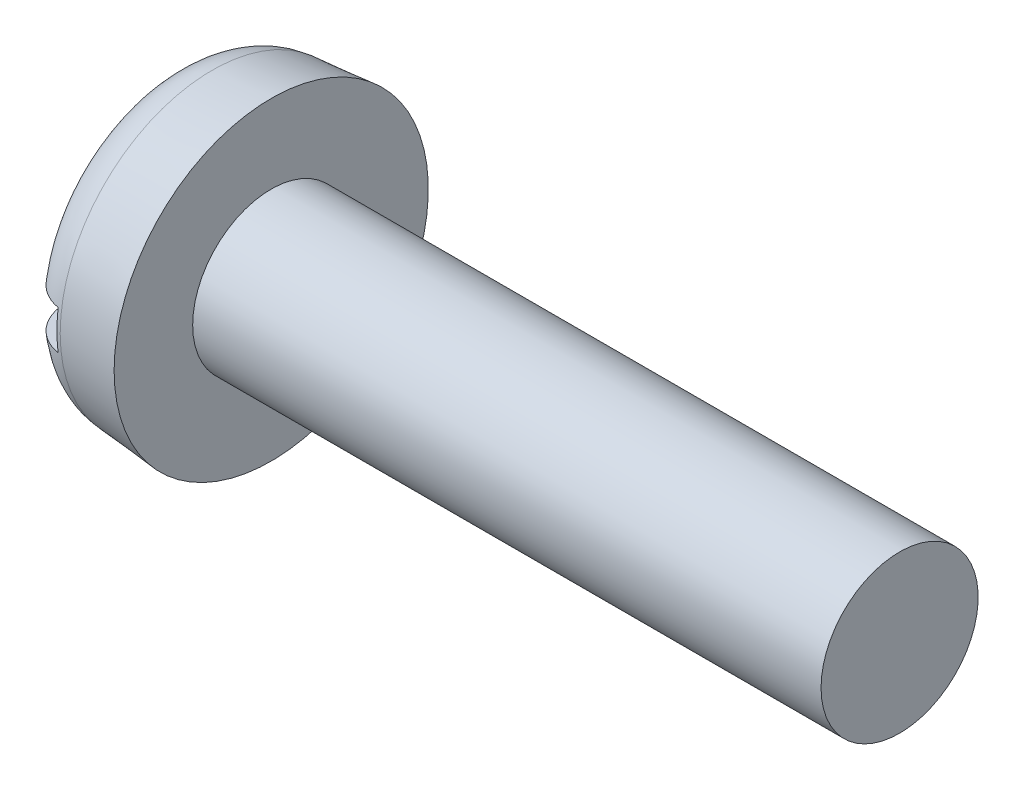
ISO-10303-21;
HEADER;
FILE_DESCRIPTION(('STEP AP214'),'2;1');
FILE_NAME('part.step','',(''),(''),'','','');
FILE_SCHEMA(('AUTOMOTIVE_DESIGN { 1 0 10303 214 1 1 1 1 }'));
ENDSEC;
DATA;
#1=APPLICATION_CONTEXT('core data for automotive mechanical design processes');
#2=APPLICATION_PROTOCOL_DEFINITION('international standard','automotive_design',2000,#1);
#3=PRODUCT_CONTEXT('',#1,'mechanical');
#4=PRODUCT('Part','Part','',(#3));
#5=PRODUCT_RELATED_PRODUCT_CATEGORY('part','',(#4));
#6=PRODUCT_DEFINITION_FORMATION('','',#4);
#7=PRODUCT_DEFINITION_CONTEXT('part definition',#1,'design');
#8=PRODUCT_DEFINITION('design','',#6,#7);
#9=PRODUCT_DEFINITION_SHAPE('','',#8);
#10=(LENGTH_UNIT() NAMED_UNIT(*) SI_UNIT(.MILLI.,.METRE.));
#11=(NAMED_UNIT(*) PLANE_ANGLE_UNIT() SI_UNIT($,.RADIAN.));
#12=(NAMED_UNIT(*) SI_UNIT($,.STERADIAN.) SOLID_ANGLE_UNIT());
#13=UNCERTAINTY_MEASURE_WITH_UNIT(LENGTH_MEASURE(1.E-05),#10,'distance_accuracy_value','');
#14=(GEOMETRIC_REPRESENTATION_CONTEXT(3) GLOBAL_UNCERTAINTY_ASSIGNED_CONTEXT((#13)) GLOBAL_UNIT_ASSIGNED_CONTEXT((#10,
#11,#12)) REPRESENTATION_CONTEXT('',''));
#15=CARTESIAN_POINT('',(0.,0.,0.));
#16=DIRECTION('',(0.,0.,1.));
#17=DIRECTION('',(1.,0.,0.));
#18=AXIS2_PLACEMENT_3D('',#15,#16,#17);
#19=CARTESIAN_POINT('',(0.,0.,0.));
#20=DIRECTION('',(-1.,0.,0.));
#21=DIRECTION('',(0.,0.,1.));
#22=AXIS2_PLACEMENT_3D('',#19,#20,#21);
#23=PLANE('',#22);
#24=DIRECTION('',(0.,0.,-1.));
#25=VECTOR('',#24,1.);
#26=CARTESIAN_POINT('',(0.,0.25,2.));
#27=LINE('',#26,#25);
#28=CARTESIAN_POINT('',(0.,0.25,1.3128752634498));
#29=VERTEX_POINT('',#28);
#30=CARTESIAN_POINT('',(0.,0.25,-1.3128752634498));
#31=VERTEX_POINT('',#30);
#32=EDGE_CURVE('E89',#29,#31,#27,.T.);
#33=ORIENTED_EDGE('',*,*,#32,.F.);
#34=CARTESIAN_POINT('',(0.,0.,0.));
#35=DIRECTION('',(-1.,0.,0.));
#36=DIRECTION('',(0.,0.,1.));
#37=AXIS2_PLACEMENT_3D('',#34,#35,#36);
#38=CIRCLE('',#37,1.33646603300584);
#39=EDGE_CURVE('E95',#29,#31,#38,.T.);
#40=ORIENTED_EDGE('',*,*,#39,.T.);
#41=EDGE_LOOP('',(#33,#40));
#42=FACE_BOUND('',#41,.T.);
#43=ADVANCED_FACE('F35',(#42),#23,.T.);
#44=CARTESIAN_POINT('',(-25.4,0.,0.));
#45=DIRECTION('',(-1.,0.,0.));
#46=DIRECTION('',(0.,0.,1.));
#47=AXIS2_PLACEMENT_3D('',#44,#45,#46);
#48=CYLINDRICAL_SURFACE('',#47,1.);
#49=CARTESIAN_POINT('',(9.3,0.,0.));
#50=DIRECTION('',(-1.,0.,0.));
#51=DIRECTION('',(0.,0.,1.));
#52=AXIS2_PLACEMENT_3D('',#49,#50,#51);
#53=CIRCLE('',#52,1.);
#54=CARTESIAN_POINT('',(9.3,0.,1.));
#55=VERTEX_POINT('',#54);
#56=EDGE_CURVE('E96',#55,#55,#53,.T.);
#57=ORIENTED_EDGE('',*,*,#56,.T.);
#58=EDGE_LOOP('',(#57));
#59=FACE_BOUND('',#58,.T.);
#60=CARTESIAN_POINT('',(1.3,0.,0.));
#61=DIRECTION('',(-1.,0.,0.));
#62=DIRECTION('',(0.,0.,1.));
#63=AXIS2_PLACEMENT_3D('',#60,#61,#62);
#64=CIRCLE('',#63,1.);
#65=CARTESIAN_POINT('',(1.3,0.,1.));
#66=VERTEX_POINT('',#65);
#67=EDGE_CURVE('E156',#66,#66,#64,.T.);
#68=ORIENTED_EDGE('',*,*,#67,.F.);
#69=EDGE_LOOP('',(#68));
#70=FACE_BOUND('',#69,.T.);
#71=ADVANCED_FACE('F144',(#59,#70),#48,.T.);
#72=CARTESIAN_POINT('',(9.3,1.,0.));
#73=DIRECTION('',(1.,0.,0.));
#74=DIRECTION('',(0.,0.,-1.));
#75=AXIS2_PLACEMENT_3D('',#72,#73,#74);
#76=PLANE('',#75);
#77=ORIENTED_EDGE('',*,*,#56,.F.);
#78=EDGE_LOOP('',(#77));
#79=FACE_BOUND('',#78,.T.);
#80=ADVANCED_FACE('F142',(#79),#76,.T.);
#81=DIRECTION('',(0.,0.,1.));
#82=VECTOR('',#81,1.);
#83=CARTESIAN_POINT('',(0.,-0.25,-2.));
#84=LINE('',#83,#82);
#85=CARTESIAN_POINT('',(0.,-0.25,-1.3128752634498));
#86=VERTEX_POINT('',#85);
#87=CARTESIAN_POINT('',(0.,-0.25,1.3128752634498));
#88=VERTEX_POINT('',#87);
#89=EDGE_CURVE('E80',#86,#88,#84,.T.);
#90=ORIENTED_EDGE('',*,*,#89,.F.);
#91=EDGE_CURVE('E87',#86,#88,#38,.T.);
#92=ORIENTED_EDGE('',*,*,#91,.T.);
#93=EDGE_LOOP('',(#90,#92));
#94=FACE_BOUND('',#93,.T.);
#95=ADVANCED_FACE('F86',(#94),#23,.T.);
#96=CARTESIAN_POINT('',(0.,0.,0.));
#97=DIRECTION('',(1.,0.,0.));
#98=DIRECTION('',(0.,0.,-1.));
#99=AXIS2_PLACEMENT_3D('',#96,#97,#98);
#100=CONICAL_SURFACE('',#99,1.8862647374163,0.0872664625997166);
#101=CARTESIAN_POINT('',(0.547706554351404,0.,0.));
#102=DIRECTION('',(-1.,0.,0.));
#103=DIRECTION('',(0.,0.,1.));
#104=AXIS2_PLACEMENT_3D('',#101,#102,#103);
#105=CIRCLE('',#104,1.93418285186089);
#106=CARTESIAN_POINT('',(0.547706554351404,0.,1.93418285186089));
#107=VERTEX_POINT('',#106);
#108=EDGE_CURVE('E99',#107,#107,#105,.F.);
#109=ORIENTED_EDGE('',*,*,#108,.T.);
#110=EDGE_LOOP('',(#109));
#111=FACE_BOUND('',#110,.T.);
#112=CARTESIAN_POINT('',(1.3,0.,0.));
#113=DIRECTION('',(-1.,0.,0.));
#114=DIRECTION('',(0.,0.,1.));
#115=AXIS2_PLACEMENT_3D('',#112,#113,#114);
#116=CIRCLE('',#115,2.);
#117=CARTESIAN_POINT('',(1.3,0.,2.));
#118=VERTEX_POINT('',#117);
#119=EDGE_CURVE('E101',#118,#118,#116,.T.);
#120=ORIENTED_EDGE('',*,*,#119,.T.);
#121=EDGE_LOOP('',(#120));
#122=FACE_BOUND('',#121,.T.);
#123=ADVANCED_FACE('F135',(#111,#122),#100,.T.);
#124=CARTESIAN_POINT('',(1.3,1.,0.));
#125=DIRECTION('',(-1.,0.,0.));
#126=DIRECTION('',(0.,0.,1.));
#127=AXIS2_PLACEMENT_3D('',#124,#125,#126);
#128=PLANE('',#127);
#129=ORIENTED_EDGE('',*,*,#119,.F.);
#130=EDGE_LOOP('',(#129));
#131=FACE_BOUND('',#130,.T.);
#132=ORIENTED_EDGE('',*,*,#67,.T.);
#133=EDGE_LOOP('',(#132));
#134=FACE_BOUND('',#133,.T.);
#135=ADVANCED_FACE('F131',(#131,#134),#128,.F.);
#136=CARTESIAN_POINT('',(0.6,0.,0.));
#137=DIRECTION('',(-1.,0.,0.));
#138=DIRECTION('',(0.,0.,1.));
#139=AXIS2_PLACEMENT_3D('',#136,#137,#138);
#140=TOROIDAL_SURFACE('',#139,1.33646603300584,0.6);
#141=CARTESIAN_POINT('',(0.274780655200361,0.25,-1.82362420667529));
#142=CARTESIAN_POINT('',(0.302850124065662,0.25,-1.84189666141675));
#143=CARTESIAN_POINT('',(0.332476912836235,0.25,-1.85782010480749));
#144=CARTESIAN_POINT('',(0.394006386294874,0.25,-1.8844828387307));
#145=CARTESIAN_POINT('',(0.425911622330593,0.25,-1.89521620967586));
#146=CARTESIAN_POINT('',(0.49106542171139,0.25,-1.91116335358415));
#147=CARTESIAN_POINT('',(0.524313546486278,0.25,-1.91637891370101));
#148=CARTESIAN_POINT('',(0.591204792683811,0.25,-1.92113959303415));
#149=CARTESIAN_POINT('',(0.624847818162146,0.25,-1.92068606223462));
#150=CARTESIAN_POINT('',(0.691513871966761,0.25,-1.91413229696864));
#151=CARTESIAN_POINT('',(0.724537965843794,0.25,-1.90804289638476));
#152=CARTESIAN_POINT('',(0.789097481854443,0.25,-1.89041111372299));
#153=CARTESIAN_POINT('',(0.820632856008674,0.25,-1.87886855602915));
#154=CARTESIAN_POINT('',(0.881355504744871,0.25,-1.85065407323916));
#155=CARTESIAN_POINT('',(0.910540461536868,0.25,-1.8339771613426));
#156=CARTESIAN_POINT('',(0.965713973197687,0.25,-1.7959832160475));
#157=CARTESIAN_POINT('',(0.991702483157431,0.25,-1.77466611746743));
#158=CARTESIAN_POINT('',(1.03989067692429,0.25,-1.72788939986325));
#159=CARTESIAN_POINT('',(1.06207077173726,0.25,-1.70240960587084));
#160=CARTESIAN_POINT('',(1.10188385808005,0.25,-1.64811708765422));
#161=CARTESIAN_POINT('',(1.11951669564412,0.25,-1.61930425062421));
#162=CARTESIAN_POINT('',(1.14991644324992,0.25,-1.55888388907361));
#163=CARTESIAN_POINT('',(1.16263701266532,0.25,-1.52725305653232));
#164=CARTESIAN_POINT('',(1.18266472006596,0.25,-1.46232290586992));
#165=CARTESIAN_POINT('',(1.18997153304379,0.25,-1.42902348770568));
#166=CARTESIAN_POINT('',(1.1990757467124,0.25,-1.36122512528321));
#167=CARTESIAN_POINT('',(1.2007978533932,0.25,-1.3267160782536));
#168=CARTESIAN_POINT('',(1.19852158611446,0.25,-1.25788795964169));
#169=CARTESIAN_POINT('',(1.19452272743365,0.25,-1.22356890440419));
#170=CARTESIAN_POINT('',(1.18084584012593,0.25,-1.15550299104831));
#171=CARTESIAN_POINT('',(1.1710768980116,0.25,-1.12177439719896));
#172=CARTESIAN_POINT('',(1.14608963326822,0.25,-1.05639845281472));
#173=CARTESIAN_POINT('',(1.13087072283895,0.25,-1.02475132721021));
#174=CARTESIAN_POINT('',(1.09517672424942,0.25,-0.964015185217592));
#175=CARTESIAN_POINT('',(1.07463585116154,0.25,-0.934964791126672));
#176=CARTESIAN_POINT('',(1.0289468611237,0.25,-0.880736843040394));
#177=CARTESIAN_POINT('',(1.00379831827947,0.25,-0.855559647447028));
#178=CARTESIAN_POINT('',(0.949690395648163,0.25,-0.809995267822458));
#179=CARTESIAN_POINT('',(0.920750663668052,0.25,-0.789584802369704));
#180=CARTESIAN_POINT('',(0.859743350231913,0.25,-0.754142685467499));
#181=CARTESIAN_POINT('',(0.827676707896818,0.25,-0.739109425347756));
#182=CARTESIAN_POINT('',(0.762667368563303,0.25,-0.715550940340568));
#183=CARTESIAN_POINT('',(0.729809776019389,0.25,-0.706791374099582));
#184=CARTESIAN_POINT('',(0.663065073704784,0.25,-0.695254567880968));
#185=CARTESIAN_POINT('',(0.629178416423444,0.25,-0.69247473610395));
#186=CARTESIAN_POINT('',(0.563211392329522,0.25,-0.693020234763517));
#187=CARTESIAN_POINT('',(0.531128042957494,0.25,-0.696037951412193));
#188=CARTESIAN_POINT('',(0.467930020079841,0.25,-0.707432616918485));
#189=CARTESIAN_POINT('',(0.436815388934093,0.25,-0.715809799789359));
#190=CARTESIAN_POINT('',(0.376446381647119,0.25,-0.737546549416802));
#191=CARTESIAN_POINT('',(0.347188974627552,0.25,-0.750897740765059));
#192=CARTESIAN_POINT('',(0.29118144985243,0.25,-0.782096393740082));
#193=CARTESIAN_POINT('',(0.264431855473699,0.25,-0.799944791073732));
#194=CARTESIAN_POINT('',(0.21280112205241,0.25,-0.840563479123866));
#195=CARTESIAN_POINT('',(0.18807630516109,0.25,-0.863532471122662));
#196=CARTESIAN_POINT('',(0.142632089074548,0.25,-0.913140155498345));
#197=CARTESIAN_POINT('',(0.121913544381091,0.25,-0.939779628685344));
#198=CARTESIAN_POINT('',(0.0841798141603358,0.25,-0.997238681509955));
#199=CARTESIAN_POINT('',(0.0673637911083437,0.25,-1.02818930073671));
#200=CARTESIAN_POINT('',(0.0390991703503447,0.25,-1.09245311591645));
#201=CARTESIAN_POINT('',(0.0276510234354347,0.25,-1.12576651002353));
#202=CARTESIAN_POINT('',(0.0103722361801808,0.25,-1.19421384118873));
#203=CARTESIAN_POINT('',(0.0046047866229466,0.25,-1.2293637757047));
#204=CARTESIAN_POINT('',(-0.000878679151094724,0.25,-1.30013265464533));
#205=CARTESIAN_POINT('',(-0.000595165424060139,0.25,-1.33575156242399));
#206=CARTESIAN_POINT('',(0.00602927957051824,0.25,-1.40603493785938));
#207=CARTESIAN_POINT('',(0.0123048116822739,0.25,-1.44070555722832));
#208=CARTESIAN_POINT('',(0.0306887868415263,0.25,-1.50847558350848));
#209=CARTESIAN_POINT('',(0.0427982176917193,0.25,-1.54157472329189));
#210=CARTESIAN_POINT('',(0.0722935157774219,0.25,-1.60468559872415));
#211=CARTESIAN_POINT('',(0.0895922457386432,0.25,-1.63473812116026));
#212=CARTESIAN_POINT('',(0.129048154505429,0.25,-1.6914266708082));
#213=CARTESIAN_POINT('',(0.151198946684604,0.25,-1.71806711686356));
#214=CARTESIAN_POINT('',(0.190498702041562,0.25,-1.75782741941758));
#215=CARTESIAN_POINT('',(0.206359023192159,0.25,-1.77224346176931));
#216=CARTESIAN_POINT('',(0.23952762918078,0.25,-1.79930107726038));
#217=CARTESIAN_POINT('',(0.256835902453732,0.25,-1.81194266457048));
#218=CARTESIAN_POINT('',(0.274780655200361,0.25,-1.82362420667529));
#219=B_SPLINE_CURVE_WITH_KNOTS('',3,(#141,#142,#143,#144,#145,#146,#147,#148,#149,#150,#151,
#152,#153,#154,#155,#156,#157,#158,#159,#160,#161,#162,#163,#164,#165,#166,#167,#168,#169,#170,
#171,#172,#173,#174,#175,#176,#177,#178,#179,#180,#181,#182,#183,#184,#185,#186,#187,#188,#189,
#190,#191,#192,#193,#194,#195,#196,#197,#198,#199,#200,#201,#202,#203,#204,#205,#206,#207,#208,
#209,#210,#211,#212,#213,#214,#215,#216,#217,#218),.UNSPECIFIED.,.T.,.F.,(4,2,2,2,2,2,2,2,2,2,2,
2,2,2,2,2,2,2,2,2,2,2,2,2,2,2,2,2,2,2,2,2,2,2,2,2,2,2,4),(0.,0.100401062182579,
0.200916369230917,0.301399110583017,0.401857924372673,0.502124025494567,0.602393355851687,
0.702760382831541,0.803128819775641,0.903998978686787,1.00487255251616,1.10667574998262,
1.20848505856888,1.31166139334771,1.41484647048427,1.5197024094854,1.62456966101414,
1.73080076101002,1.83704168507411,1.94275232230141,2.04843130812937,2.14992147627128,
2.25136764660652,2.34757938832311,2.44379533127149,2.53984998938428,2.6359246495452,
2.73671855873459,2.83753394270023,2.9427139364961,3.04790276166498,3.1542488966228,
3.26058677033834,3.36577714242787,3.4709853317399,3.57451735589247,3.67791391414109,
3.74210061585798,3.8062868049523),.UNSPECIFIED.);
#220=CARTESIAN_POINT('',(0.5,0.25,-1.91179742470572));
#221=VERTEX_POINT('',#220);
#222=EDGE_CURVE('E11',#31,#221,#219,.T.);
#223=ORIENTED_EDGE('',*,*,#222,.F.);
#224=ORIENTED_EDGE('',*,*,#39,.F.);
#225=CARTESIAN_POINT('',(0.25647797126752,0.25,0.806687931408376));
#226=CARTESIAN_POINT('',(0.283073772587687,0.25,0.787245268924266));
#227=CARTESIAN_POINT('',(0.311256734673757,0.25,0.769944535846651));
#228=CARTESIAN_POINT('',(0.370114008258176,0.25,0.740229039319213));
#229=CARTESIAN_POINT('',(0.400789824440839,0.25,0.727817253657524));
#230=CARTESIAN_POINT('',(0.463871915221717,0.25,0.708374903085697));
#231=CARTESIAN_POINT('',(0.496281146765579,0.25,0.701353868838656));
#232=CARTESIAN_POINT('',(0.561820079529305,0.25,0.693064165401108));
#233=CARTESIAN_POINT('',(0.594949507008968,0.25,0.691793347727689));
#234=CARTESIAN_POINT('',(0.659868599580709,0.25,0.695008568960631));
#235=CARTESIAN_POINT('',(0.691667437306452,0.25,0.699313344775918));
#236=CARTESIAN_POINT('',(0.754098929301161,0.25,0.713169938820386));
#237=CARTESIAN_POINT('',(0.784731434429555,0.25,0.722722425688242));
#238=CARTESIAN_POINT('',(0.844220886452171,0.25,0.746760750983483));
#239=CARTESIAN_POINT('',(0.873064893626733,0.25,0.761278483323786));
#240=CARTESIAN_POINT('',(0.928072070248523,0.25,0.794719206207591));
#241=CARTESIAN_POINT('',(0.954234673131182,0.25,0.81364312499944));
#242=CARTESIAN_POINT('',(1.00455764012357,0.25,0.856403426025716));
#243=CARTESIAN_POINT('',(1.02854601727969,0.25,0.880442281861904));
#244=CARTESIAN_POINT('',(1.07233969055911,0.25,0.93206911063745));
#245=CARTESIAN_POINT('',(1.09214414470062,0.25,0.959657796158255));
#246=CARTESIAN_POINT('',(1.1277806057224,0.25,1.01880991735135));
#247=CARTESIAN_POINT('',(1.14342273788476,0.25,1.05048797462787));
#248=CARTESIAN_POINT('',(1.16921417457241,0.25,1.11600811372881));
#249=CARTESIAN_POINT('',(1.17936312023956,0.25,1.14985033677212));
#250=CARTESIAN_POINT('',(1.19390640883483,0.25,1.21901855241697));
#251=CARTESIAN_POINT('',(1.198256990977,0.25,1.25435377468586));
#252=CARTESIAN_POINT('',(1.20088701701162,0.25,1.32525082928571));
#253=CARTESIAN_POINT('',(1.19916675302153,0.25,1.36081265063096));
#254=CARTESIAN_POINT('',(1.18971168250471,0.25,1.43069187166979));
#255=CARTESIAN_POINT('',(1.18204966947663,0.25,1.46501910735442));
#256=CARTESIAN_POINT('',(1.16097413489613,0.25,1.53186104297244));
#257=CARTESIAN_POINT('',(1.14756110125118,0.25,1.5643758964011));
#258=CARTESIAN_POINT('',(1.11560510746244,0.25,1.62610187095566));
#259=CARTESIAN_POINT('',(1.097149951566,0.25,1.65535845455428));
#260=CARTESIAN_POINT('',(1.05552533497899,0.25,1.71030063892362));
#261=CARTESIAN_POINT('',(1.03235623843943,0.25,1.73598651527295));
#262=CARTESIAN_POINT('',(0.982310027591305,0.25,1.78268807238429));
#263=CARTESIAN_POINT('',(0.955488368089889,0.25,1.80376319341113));
#264=CARTESIAN_POINT('',(0.898659765129522,0.25,1.8410604546949));
#265=CARTESIAN_POINT('',(0.868652997996469,0.25,1.85728286340582));
#266=CARTESIAN_POINT('',(0.806611342278962,0.25,1.88426128245479));
#267=CARTESIAN_POINT('',(0.774598152543608,0.25,1.89506720989169));
#268=CARTESIAN_POINT('',(0.709207275735754,0.25,1.91112053581599));
#269=CARTESIAN_POINT('',(0.67582963400342,0.25,1.91636811884914));
#270=CARTESIAN_POINT('',(0.608837656027687,0.25,1.92113717337632));
#271=CARTESIAN_POINT('',(0.575225363311112,0.25,1.92068739829934));
#272=CARTESIAN_POINT('',(0.508554909070377,0.25,1.91414489858889));
#273=CARTESIAN_POINT('',(0.475496740593514,0.25,1.90805224481175));
#274=CARTESIAN_POINT('',(0.410905076842549,0.25,1.89041194259857));
#275=CARTESIAN_POINT('',(0.379370111612107,0.25,1.87886967409414));
#276=CARTESIAN_POINT('',(0.318677746934266,0.25,1.85066978427311));
#277=CARTESIAN_POINT('',(0.289520360090016,0.25,1.83401213584294));
#278=CARTESIAN_POINT('',(0.234312878154215,0.25,1.79600861494103));
#279=CARTESIAN_POINT('',(0.20827228119735,0.25,1.77464894819558));
#280=CARTESIAN_POINT('',(0.160116194508203,0.25,1.72788872147726));
#281=CARTESIAN_POINT('',(0.13800080840638,0.25,1.70248805485052));
#282=CARTESIAN_POINT('',(0.0981483460954305,0.25,1.64818018628309));
#283=CARTESIAN_POINT('',(0.0804433545930309,0.25,1.61924944626991));
#284=CARTESIAN_POINT('',(0.0500800334875073,0.25,1.55885213954979));
#285=CARTESIAN_POINT('',(0.0374219573508648,0.25,1.52738544557741));
#286=CARTESIAN_POINT('',(0.0173499908938403,0.25,1.46242951274809));
#287=CARTESIAN_POINT('',(0.00999744820991976,0.25,1.42892132543473));
#288=CARTESIAN_POINT('',(0.000932027792608532,0.25,1.36115298475673));
#289=CARTESIAN_POINT('',(-0.00078066275159485,0.25,1.32689280647116));
#290=CARTESIAN_POINT('',(0.00145026647964888,0.25,1.25804055944597));
#291=CARTESIAN_POINT('',(0.0054795473212617,0.25,1.22345127364072));
#292=CARTESIAN_POINT('',(0.0191955913899645,0.25,1.15540432623591));
#293=CARTESIAN_POINT('',(0.0288841889000252,0.25,1.12194703525683));
#294=CARTESIAN_POINT('',(0.0538243357846501,0.25,1.05655247440412));
#295=CARTESIAN_POINT('',(0.0691636585180377,0.25,1.02464870679869));
#296=CARTESIAN_POINT('',(0.104937128864068,0.25,0.963866007236643));
#297=CARTESIAN_POINT('',(0.125366421619971,0.25,0.934984229941663));
#298=CARTESIAN_POINT('',(0.164028944144066,0.25,0.889058344229295));
#299=CARTESIAN_POINT('',(0.181121312132095,0.25,0.87104130385289));
#300=CARTESIAN_POINT('',(0.217335307543651,0.25,0.837174222613301));
#301=CARTESIAN_POINT('',(0.236456923370607,0.25,0.821324169367588));
#302=CARTESIAN_POINT('',(0.25647797126752,0.25,0.806687931408376));
#303=B_SPLINE_CURVE_WITH_KNOTS('',3,(#225,#226,#227,#228,#229,#230,#231,#232,#233,#234,#235,
#236,#237,#238,#239,#240,#241,#242,#243,#244,#245,#246,#247,#248,#249,#250,#251,#252,#253,#254,
#255,#256,#257,#258,#259,#260,#261,#262,#263,#264,#265,#266,#267,#268,#269,#270,#271,#272,#273,
#274,#275,#276,#277,#278,#279,#280,#281,#282,#283,#284,#285,#286,#287,#288,#289,#290,#291,#292,
#293,#294,#295,#296,#297,#298,#299,#300,#301,#302),.UNSPECIFIED.,.T.,.F.,(4,2,2,2,2,2,2,2,2,2,2,
2,2,2,2,2,2,2,2,2,2,2,2,2,2,2,2,2,2,2,2,2,2,2,2,2,2,2,4),(0.,0.0987501477700194,
0.19756035018262,0.296544845923676,0.39549235452428,0.491302394396121,0.587124644765227,
0.68357433728144,0.780044367203688,0.881471955879884,0.9829199366625,1.08841286316154,
1.19391268045661,1.30020428911123,1.40649078328765,1.51149532344498,1.61649095694569,
1.71976342015201,1.82302790860739,1.92487039176505,2.02670723991341,2.12758748528433,
2.22846438116773,2.32883237519779,2.42919910894713,2.52946696584731,2.62973535421627,
2.73030191514127,2.83087113075401,2.93215189853696,3.03343775220811,3.13587677944123,
3.23831920663671,3.34230600671742,3.44632652944514,3.5520360732953,3.65764517390562,
3.73198370247418,3.80632180624214),.UNSPECIFIED.);
#304=CARTESIAN_POINT('',(0.5,0.25,1.91179742470572));
#305=VERTEX_POINT('',#304);
#306=EDGE_CURVE('E114',#305,#29,#303,.T.);
#307=ORIENTED_EDGE('',*,*,#306,.F.);
#308=CARTESIAN_POINT('',(0.5,0.,0.));
#309=DIRECTION('',(-1.,0.,0.));
#310=DIRECTION('',(0.,0.,1.));
#311=AXIS2_PLACEMENT_3D('',#308,#309,#310);
#312=CIRCLE('',#311,1.92807401131581);
#313=CARTESIAN_POINT('',(0.5,-0.25,1.91179742470572));
#314=VERTEX_POINT('',#313);
#315=EDGE_CURVE('E107',#305,#314,#312,.F.);
#316=ORIENTED_EDGE('',*,*,#315,.T.);
#317=CARTESIAN_POINT('',(0.25647797126752,-0.25,0.806687931408376));
#318=CARTESIAN_POINT('',(0.22811461508231,-0.25,0.827425620219486));
#319=CARTESIAN_POINT('',(0.201516055297732,-0.25,0.850630894293789));
#320=CARTESIAN_POINT('',(0.152571331977692,-0.25,0.901208782716564));
#321=CARTESIAN_POINT('',(0.130232677758372,-0.25,0.928588605834286));
#322=CARTESIAN_POINT('',(0.0904534192406149,-0.25,0.986651718459008));
#323=CARTESIAN_POINT('',(0.0730064503192135,-0.25,1.0173306428444));
#324=CARTESIAN_POINT('',(0.0434602329462481,-0.25,1.08114792064194));
#325=CARTESIAN_POINT('',(0.0313588569417125,-0.25,1.11428528944574));
#326=CARTESIAN_POINT('',(0.0127636490885256,-0.25,1.1824429151294));
#327=CARTESIAN_POINT('',(0.00632467814466832,-0.25,1.21747817526152));
#328=CARTESIAN_POINT('',(-0.000517283901222851,-0.25,1.28813764188796));
#329=CARTESIAN_POINT('',(-0.000920002337641604,-0.25,1.3237618749142));
#330=CARTESIAN_POINT('',(0.00434800778750704,-0.25,1.39420239184286));
#331=CARTESIAN_POINT('',(0.00995817056286311,-0.25,1.42902319077614));
#332=CARTESIAN_POINT('',(0.0270441493196886,-0.25,1.49719541380208));
#333=CARTESIAN_POINT('',(0.0385194335615698,-0.25,1.53054697080046));
#334=CARTESIAN_POINT('',(0.066805333326315,-0.25,1.59425150405687));
#335=CARTESIAN_POINT('',(0.083525525219693,-0.25,1.62464463268788));
#336=CARTESIAN_POINT('',(0.121902514595007,-0.25,1.6821361772215));
#337=CARTESIAN_POINT('',(0.143558907828022,-0.25,1.70923486264318));
#338=CARTESIAN_POINT('',(0.190851277951756,-0.25,1.75895715118281));
#339=CARTESIAN_POINT('',(0.216425242565036,-0.25,1.78163974924995));
#340=CARTESIAN_POINT('',(0.271051715066319,-0.25,1.82233619463279));
#341=CARTESIAN_POINT('',(0.30010402112743,-0.25,1.84035031264008));
#342=CARTESIAN_POINT('',(0.360541640657975,-0.25,1.87101228101318));
#343=CARTESIAN_POINT('',(0.39190020239549,-0.25,1.88371287767629));
#344=CARTESIAN_POINT('',(0.456312001468162,-0.25,1.90363448924139));
#345=CARTESIAN_POINT('',(0.489365175345781,-0.25,1.91085570916788));
#346=CARTESIAN_POINT('',(0.556022772858472,-0.25,1.91957878374415));
#347=CARTESIAN_POINT('',(0.589622905521806,-0.25,1.92111345806165));
#348=CARTESIAN_POINT('',(0.656602284044621,-0.25,1.91850953421242));
#349=CARTESIAN_POINT('',(0.689981533445374,-0.25,1.9143710272225));
#350=CARTESIAN_POINT('',(0.755513913993921,-0.25,1.9005544490505));
#351=CARTESIAN_POINT('',(0.787669009716197,-0.25,1.89088569056007));
#352=CARTESIAN_POINT('',(0.849904715559474,-0.25,1.86629884137169));
#353=CARTESIAN_POINT('',(0.879985320055665,-0.25,1.85138073644125));
#354=CARTESIAN_POINT('',(0.937296248504193,-0.25,1.8166898208882));
#355=CARTESIAN_POINT('',(0.964519921503605,-0.25,1.79690602558855));
#356=CARTESIAN_POINT('',(1.01528516641715,-0.25,1.75307523190286));
#357=CARTESIAN_POINT('',(1.03882665732028,-0.25,1.72902813974565));
#358=CARTESIAN_POINT('',(1.08172595916947,-0.25,1.6771960618535));
#359=CARTESIAN_POINT('',(1.10105627962252,-0.25,1.64938832937458));
#360=CARTESIAN_POINT('',(1.13482995867941,-0.25,1.59094992813551));
#361=CARTESIAN_POINT('',(1.1492731095708,-0.25,1.56031913946136));
#362=CARTESIAN_POINT('',(1.17303442993066,-0.25,1.49675978182125));
#363=CARTESIAN_POINT('',(1.18229654757927,-0.25,1.46381026645167));
#364=CARTESIAN_POINT('',(1.19524406921989,-0.25,1.39683436474365));
#365=CARTESIAN_POINT('',(1.19892909236176,-0.25,1.36280790502451));
#366=CARTESIAN_POINT('',(1.2006801090878,-0.25,1.29411335821481));
#367=CARTESIAN_POINT('',(1.19866316593094,-0.25,1.25944316342795));
#368=CARTESIAN_POINT('',(1.18893397437426,-0.25,1.19091174344461));
#369=CARTESIAN_POINT('',(1.18122120940792,-0.25,1.15705059190959));
#370=CARTESIAN_POINT('',(1.1601769908767,-0.25,1.09051812196973));
#371=CARTESIAN_POINT('',(1.14675676173025,-0.25,1.05787487044025));
#372=CARTESIAN_POINT('',(1.11467775754884,-0.25,0.995269036554545));
#373=CARTESIAN_POINT('',(1.09601835733878,-0.25,0.965306774676048));
#374=CARTESIAN_POINT('',(1.05376852779922,-0.25,0.90864809451225));
#375=CARTESIAN_POINT('',(1.03013402245569,-0.25,0.881984499365602));
#376=CARTESIAN_POINT('',(0.978662413228472,-0.25,0.833068820610379));
#377=CARTESIAN_POINT('',(0.950825230537789,-0.25,0.810816819744432));
#378=CARTESIAN_POINT('',(0.892141273449015,-0.25,0.771800498870371));
#379=CARTESIAN_POINT('',(0.861346635725294,-0.25,0.754957957909246));
#380=CARTESIAN_POINT('',(0.797264463313658,-0.25,0.726991035263803));
#381=CARTESIAN_POINT('',(0.7639781524147,-0.25,0.715863867305707));
#382=CARTESIAN_POINT('',(0.697614354203182,-0.25,0.700248790529691));
#383=CARTESIAN_POINT('',(0.664607567426841,-0.25,0.69546044216975));
#384=CARTESIAN_POINT('',(0.598260395579764,-0.25,0.691762050694227));
#385=CARTESIAN_POINT('',(0.56492001469045,-0.25,0.692851933990089));
#386=CARTESIAN_POINT('',(0.500305713906347,-0.25,0.700686922928174));
#387=CARTESIAN_POINT('',(0.469003002412091,-0.25,0.707199303446527));
#388=CARTESIAN_POINT('',(0.407926960128378,-0.25,0.725286338726901));
#389=CARTESIAN_POINT('',(0.378151979755175,-0.25,0.736855399235375));
#390=CARTESIAN_POINT('',(0.333202955789929,-0.25,0.75861828709463));
#391=CARTESIAN_POINT('',(0.317258156054092,-0.25,0.767262590798233));
#392=CARTESIAN_POINT('',(0.286211704034722,-0.25,0.785948392377951));
#393=CARTESIAN_POINT('',(0.271110004852099,-0.25,0.795989812428051));
#394=CARTESIAN_POINT('',(0.25647797126752,-0.25,0.806687931408376));
#395=B_SPLINE_CURVE_WITH_KNOTS('',3,(#317,#318,#319,#320,#321,#322,#323,#324,#325,#326,#327,
#328,#329,#330,#331,#332,#333,#334,#335,#336,#337,#338,#339,#340,#341,#342,#343,#344,#345,#346,
#347,#348,#349,#350,#351,#352,#353,#354,#355,#356,#357,#358,#359,#360,#361,#362,#363,#364,#365,
#366,#367,#368,#369,#370,#371,#372,#373,#374,#375,#376,#377,#378,#379,#380,#381,#382,#383,#384,
#385,#386,#387,#388,#389,#390,#391,#392,#393,#394),.UNSPECIFIED.,.T.,.F.,(4,2,2,2,2,2,2,2,2,2,2,
2,2,2,2,2,2,2,2,2,2,2,2,2,2,2,2,2,2,2,2,2,2,2,2,2,2,2,4),(0.,0.105339517541497,
0.210863043847173,0.316248628408819,0.421592231495568,0.527945567697215,0.634303708007108,
0.739600518645185,0.8448877846295,0.948451329469218,1.05200639604478,1.1540654205465,
1.25611852605422,1.35713304654448,1.45814378713888,1.55857063213837,1.65899586314173,
1.75925247843266,1.85950936555035,1.95999470219394,2.06048224928579,2.16160732902587,
2.2627367062024,2.36493999460764,2.46715026198412,2.57085482340577,2.67456879117567,
2.77995861689427,2.88536102382396,2.9917397945569,3.09812056031159,3.20288545926039,
3.30759923619073,3.40714743935949,3.50669439630456,3.60217675632204,3.69755374960456,
3.75189912320181,3.80624147071477),.UNSPECIFIED.);
#396=EDGE_CURVE('E94',#88,#314,#395,.T.);
#397=ORIENTED_EDGE('',*,*,#396,.F.);
#398=ORIENTED_EDGE('',*,*,#91,.F.);
#399=CARTESIAN_POINT('',(0.274780655200361,-0.25,-1.82362420667529));
#400=CARTESIAN_POINT('',(0.246412102452132,-0.25,-1.80515338183894));
#401=CARTESIAN_POINT('',(0.219592447243559,-0.25,-1.78425531890811));
#402=CARTESIAN_POINT('',(0.169833030497775,-0.25,-1.73822266295481));
#403=CARTESIAN_POINT('',(0.146898387228131,-0.25,-1.71308256697065));
#404=CARTESIAN_POINT('',(0.1055857901035,-0.25,-1.6593372656025));
#405=CARTESIAN_POINT('',(0.0872036369512321,-0.25,-1.6307352900536));
#406=CARTESIAN_POINT('',(0.0554631702647635,-0.25,-1.57088061633069));
#407=CARTESIAN_POINT('',(0.042103598378234,-0.25,-1.53962858450699));
#408=CARTESIAN_POINT('',(0.0206432771902913,-0.25,-1.47507749615836));
#409=CARTESIAN_POINT('',(0.0125876254984657,-0.25,-1.44176345508561));
#410=CARTESIAN_POINT('',(0.00209404371654314,-0.25,-1.37426177356359));
#411=CARTESIAN_POINT('',(-0.000343263952376132,-0.25,-1.34007403674719));
#412=CARTESIAN_POINT('',(0.000426825088754887,-0.25,-1.27125045227628));
#413=CARTESIAN_POINT('',(0.00371931456959648,-0.25,-1.23661556247096));
#414=CARTESIAN_POINT('',(0.0159771202394861,-0.25,-1.16836487965491));
#415=CARTESIAN_POINT('',(0.0249429593885406,-0.25,-1.1347491808909));
#416=CARTESIAN_POINT('',(0.0484576079098382,-0.25,-1.06892310437898));
#417=CARTESIAN_POINT('',(0.0630932921348853,-0.25,-1.03674374367566));
#418=CARTESIAN_POINT('',(0.0975178908169317,-0.25,-0.975266378936165));
#419=CARTESIAN_POINT('',(0.117307414846904,-0.25,-0.945968716299346));
#420=CARTESIAN_POINT('',(0.16167877507065,-0.25,-0.890885916345781));
#421=CARTESIAN_POINT('',(0.186295749588469,-0.25,-0.865129042953097));
#422=CARTESIAN_POINT('',(0.239578542918412,-0.25,-0.818201903765189));
#423=CARTESIAN_POINT('',(0.268244266621966,-0.25,-0.797031530258765));
#424=CARTESIAN_POINT('',(0.328272519519931,-0.25,-0.760396018098179));
#425=CARTESIAN_POINT('',(0.359573150112363,-0.25,-0.744829720355554));
#426=CARTESIAN_POINT('',(0.424438831887224,-0.25,-0.719501501346933));
#427=CARTESIAN_POINT('',(0.458002805134312,-0.25,-0.709736838442931));
#428=CARTESIAN_POINT('',(0.524586152437569,-0.25,-0.696826910772117));
#429=CARTESIAN_POINT('',(0.557544486769873,-0.25,-0.693366517126951));
#430=CARTESIAN_POINT('',(0.623554751672407,-0.25,-0.692262369608287));
#431=CARTESIAN_POINT('',(0.656606659486082,-0.25,-0.694617305616992));
#432=CARTESIAN_POINT('',(0.720611933799709,-0.25,-0.704833460708912));
#433=CARTESIAN_POINT('',(0.751597966403629,-0.25,-0.712492488093248));
#434=CARTESIAN_POINT('',(0.811898810445143,-0.25,-0.732772492269664));
#435=CARTESIAN_POINT('',(0.841213363360533,-0.25,-0.745394234257513));
#436=CARTESIAN_POINT('',(0.898189202124165,-0.25,-0.775523337991995));
#437=CARTESIAN_POINT('',(0.925787684286252,-0.25,-0.793149196355938));
#438=CARTESIAN_POINT('',(0.977832434568893,-0.25,-0.832561153237771));
#439=CARTESIAN_POINT('',(1.00227799166311,-0.25,-0.854348187417305));
#440=CARTESIAN_POINT('',(1.04866939922734,-0.25,-0.902723861616108));
#441=CARTESIAN_POINT('',(1.07041372154462,-0.25,-0.929505970910613));
#442=CARTESIAN_POINT('',(1.10925507245311,-0.25,-0.986252581526153));
#443=CARTESIAN_POINT('',(1.12635132905473,-0.25,-1.01621761034511));
#444=CARTESIAN_POINT('',(1.15587826370585,-0.25,-1.07945315539287));
#445=CARTESIAN_POINT('',(1.16815613299896,-0.25,-1.11279518659324));
#446=CARTESIAN_POINT('',(1.18693723838892,-0.25,-1.18106947273944));
#447=CARTESIAN_POINT('',(1.1934403543256,-0.25,-1.2160017607592));
#448=CARTESIAN_POINT('',(1.20044092616513,-0.25,-1.28644113223491));
#449=CARTESIAN_POINT('',(1.20094258611858,-0.25,-1.32194779587657));
#450=CARTESIAN_POINT('',(1.19588430233747,-0.25,-1.39252791212313));
#451=CARTESIAN_POINT('',(1.19032476970293,-0.25,-1.42760139394538));
#452=CARTESIAN_POINT('',(1.17338401955317,-0.25,-1.49576581682078));
#453=CARTESIAN_POINT('',(1.16208963405868,-0.25,-1.52887833044069));
#454=CARTESIAN_POINT('',(1.13401256129969,-0.25,-1.59268937671455));
#455=CARTESIAN_POINT('',(1.11723033304274,-0.25,-1.62338811099263));
#456=CARTESIAN_POINT('',(1.07894820628702,-0.25,-1.68097986318951));
#457=CARTESIAN_POINT('',(1.05752802949783,-0.25,-1.70792588292094));
#458=CARTESIAN_POINT('',(1.01041587459131,-0.25,-1.75778184073562));
#459=CARTESIAN_POINT('',(0.984724190633808,-0.25,-1.78069205652324));
#460=CARTESIAN_POINT('',(0.930145997257693,-0.25,-1.82153088343964));
#461=CARTESIAN_POINT('',(0.901303114330233,-0.25,-1.83951781323057));
#462=CARTESIAN_POINT('',(0.84098944475348,-0.25,-1.87034790500803));
#463=CARTESIAN_POINT('',(0.809518891529289,-0.25,-1.88319152330656));
#464=CARTESIAN_POINT('',(0.745117220679504,-0.25,-1.90327101630393));
#465=CARTESIAN_POINT('',(0.712199973113326,-0.25,-1.91055140172039));
#466=CARTESIAN_POINT('',(0.645600086806311,-0.25,-1.91946097417425));
#467=CARTESIAN_POINT('',(0.611917272957428,-0.25,-1.92108885495024));
#468=CARTESIAN_POINT('',(0.544871876047508,-0.25,-1.91864749728835));
#469=CARTESIAN_POINT('',(0.511508609397815,-0.25,-1.91459667979622));
#470=CARTESIAN_POINT('',(0.445965972419363,-0.25,-1.90095089068297));
#471=CARTESIAN_POINT('',(0.413785173235375,-0.25,-1.89136286121127));
#472=CARTESIAN_POINT('',(0.363791372711458,-0.25,-1.87176511786162));
#473=CARTESIAN_POINT('',(0.345312453158673,-0.25,-1.86340950174437));
#474=CARTESIAN_POINT('',(0.309297583953017,-0.25,-1.84486721881352));
#475=CARTESIAN_POINT('',(0.291761631921714,-0.25,-1.83468055661862));
#476=CARTESIAN_POINT('',(0.274780655200361,-0.25,-1.82362420667529));
#477=B_SPLINE_CURVE_WITH_KNOTS('',3,(#399,#400,#401,#402,#403,#404,#405,#406,#407,#408,#409,
#410,#411,#412,#413,#414,#415,#416,#417,#418,#419,#420,#421,#422,#423,#424,#425,#426,#427,#428,
#429,#430,#431,#432,#433,#434,#435,#436,#437,#438,#439,#440,#441,#442,#443,#444,#445,#446,#447,
#448,#449,#450,#451,#452,#453,#454,#455,#456,#457,#458,#459,#460,#461,#462,#463,#464,#465,#466,
#467,#468,#469,#470,#471,#472,#473,#474,#475,#476),.UNSPECIFIED.,.T.,.F.,(4,2,2,2,2,2,2,2,2,2,2,
2,2,2,2,2,2,2,2,2,2,2,2,2,2,2,2,2,2,2,2,2,2,2,2,2,2,2,4),(0.,0.101480580506103,
0.203093832917957,0.304613003415435,0.406106722427988,0.50845263418779,0.610809883665933,
0.714700232898651,0.818600159967563,0.924159397786762,1.02973112635202,1.13610190501634,
1.24247018535583,1.34680873724124,1.45109794328897,1.55001387342549,1.64890752112834,
1.74422508190664,1.83955734536687,1.93736831081816,2.0352012955127,2.13822665399301,
2.24126911334704,2.34735670277911,2.45344649961387,2.55946197564848,2.66547026163701,
2.76991930669343,2.87435961778195,2.97713002210324,3.07989335201045,3.18138079965786,
3.28285924139422,3.38351701076899,3.48419804002939,3.58455322803929,3.68478287038869,
3.74552772886801,3.80627243412447),.UNSPECIFIED.);
#478=CARTESIAN_POINT('',(0.5,-0.25,-1.91179742470572));
#479=VERTEX_POINT('',#478);
#480=EDGE_CURVE('E48',#479,#86,#477,.T.);
#481=ORIENTED_EDGE('',*,*,#480,.F.);
#482=EDGE_CURVE('E60',#479,#221,#312,.F.);
#483=ORIENTED_EDGE('',*,*,#482,.T.);
#484=EDGE_LOOP('',(#223,#224,#307,#316,#397,#398,#481,#483));
#485=FACE_BOUND('',#484,.T.);
#486=ORIENTED_EDGE('',*,*,#108,.F.);
#487=EDGE_LOOP('',(#486));
#488=FACE_BOUND('',#487,.T.);
#489=ADVANCED_FACE('F37',(#485,#488),#140,.T.);
#490=CARTESIAN_POINT('',(0.5,0.25,2.));
#491=DIRECTION('',(0.,1.,0.));
#492=DIRECTION('',(0.,0.,1.));
#493=AXIS2_PLACEMENT_3D('',#490,#491,#492);
#494=PLANE('',#493);
#495=ORIENTED_EDGE('',*,*,#222,.T.);
#496=DIRECTION('',(0.,0.,-1.));
#497=VECTOR('',#496,1.);
#498=CARTESIAN_POINT('',(0.5,0.25,2.));
#499=LINE('',#498,#497);
#500=EDGE_CURVE('E88',#305,#221,#499,.T.);
#501=ORIENTED_EDGE('',*,*,#500,.F.);
#502=ORIENTED_EDGE('',*,*,#306,.T.);
#503=ORIENTED_EDGE('',*,*,#32,.T.);
#504=EDGE_LOOP('',(#495,#501,#502,#503));
#505=FACE_BOUND('',#504,.T.);
#506=ADVANCED_FACE('F122',(#505),#494,.F.);
#507=CARTESIAN_POINT('',(0.5,-0.25,-2.));
#508=DIRECTION('',(0.,-1.,0.));
#509=DIRECTION('',(0.,0.,-1.));
#510=AXIS2_PLACEMENT_3D('',#507,#508,#509);
#511=PLANE('',#510);
#512=ORIENTED_EDGE('',*,*,#480,.T.);
#513=ORIENTED_EDGE('',*,*,#89,.T.);
#514=ORIENTED_EDGE('',*,*,#396,.T.);
#515=DIRECTION('',(0.,0.,1.));
#516=VECTOR('',#515,1.);
#517=CARTESIAN_POINT('',(0.5,-0.25,-2.));
#518=LINE('',#517,#516);
#519=EDGE_CURVE('E55',#479,#314,#518,.T.);
#520=ORIENTED_EDGE('',*,*,#519,.F.);
#521=EDGE_LOOP('',(#512,#513,#514,#520));
#522=FACE_BOUND('',#521,.T.);
#523=ADVANCED_FACE('F79',(#522),#511,.F.);
#524=CARTESIAN_POINT('',(0.5,0.25,-2.));
#525=DIRECTION('',(-1.,0.,0.));
#526=DIRECTION('',(0.,0.,1.));
#527=AXIS2_PLACEMENT_3D('',#524,#525,#526);
#528=PLANE('',#527);
#529=ORIENTED_EDGE('',*,*,#519,.T.);
#530=ORIENTED_EDGE('',*,*,#315,.F.);
#531=ORIENTED_EDGE('',*,*,#500,.T.);
#532=ORIENTED_EDGE('',*,*,#482,.F.);
#533=EDGE_LOOP('',(#529,#530,#531,#532));
#534=FACE_BOUND('',#533,.T.);
#535=ADVANCED_FACE('F121',(#534),#528,.T.);
#536=CLOSED_SHELL('',(#43,#71,#80,#95,#123,#135,#489,#506,#523,#535));
#537=MANIFOLD_SOLID_BREP('B2',#536);
#538=ADVANCED_BREP_SHAPE_REPRESENTATION('',(#18,#537),#14);
#539=SHAPE_DEFINITION_REPRESENTATION(#9,#538);
ENDSEC;
END-ISO-10303-21;
